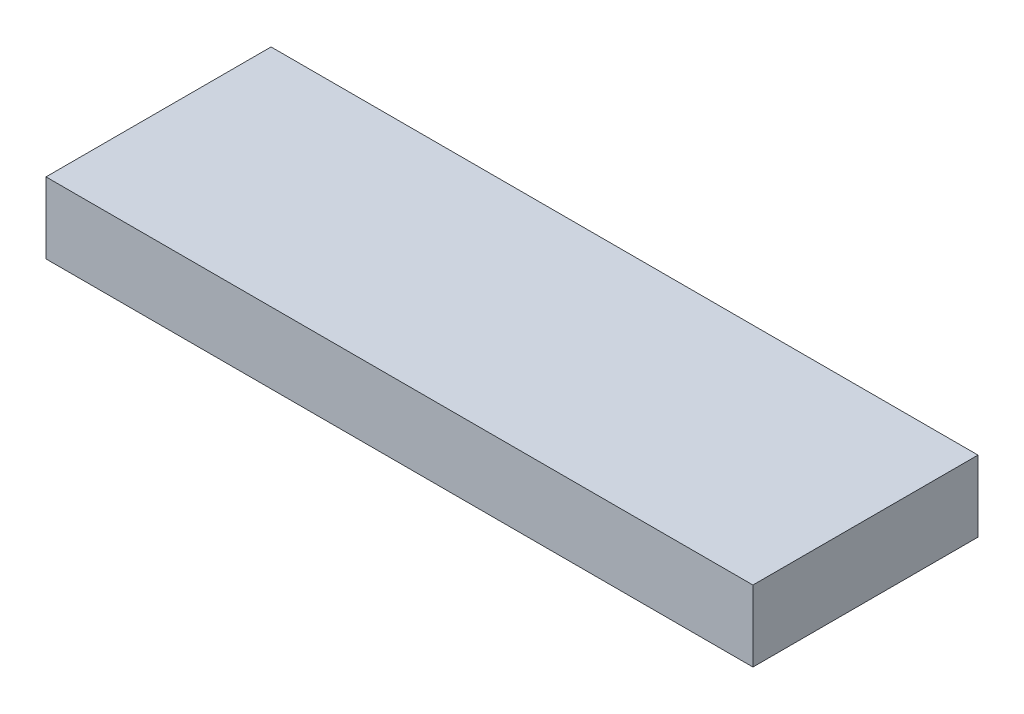
ISO-10303-21;
HEADER;
FILE_DESCRIPTION(('STEP AP214'),'2;1');
FILE_NAME('part.step','',(''),(''),'','','');
FILE_SCHEMA(('AUTOMOTIVE_DESIGN { 1 0 10303 214 1 1 1 1 }'));
ENDSEC;
DATA;
#1=APPLICATION_CONTEXT('core data for automotive mechanical design processes');
#2=APPLICATION_PROTOCOL_DEFINITION('international standard','automotive_design',2000,#1);
#3=PRODUCT_CONTEXT('',#1,'mechanical');
#4=PRODUCT('Part','Part','',(#3));
#5=PRODUCT_RELATED_PRODUCT_CATEGORY('part','',(#4));
#6=PRODUCT_DEFINITION_FORMATION('','',#4);
#7=PRODUCT_DEFINITION_CONTEXT('part definition',#1,'design');
#8=PRODUCT_DEFINITION('design','',#6,#7);
#9=PRODUCT_DEFINITION_SHAPE('','',#8);
#10=(LENGTH_UNIT() NAMED_UNIT(*) SI_UNIT(.MILLI.,.METRE.));
#11=(NAMED_UNIT(*) PLANE_ANGLE_UNIT() SI_UNIT($,.RADIAN.));
#12=(NAMED_UNIT(*) SI_UNIT($,.STERADIAN.) SOLID_ANGLE_UNIT());
#13=UNCERTAINTY_MEASURE_WITH_UNIT(LENGTH_MEASURE(1.E-05),#10,'distance_accuracy_value','');
#14=(GEOMETRIC_REPRESENTATION_CONTEXT(3) GLOBAL_UNCERTAINTY_ASSIGNED_CONTEXT((#13)) GLOBAL_UNIT_ASSIGNED_CONTEXT((#10,
#11,#12)) REPRESENTATION_CONTEXT('',''));
#15=CARTESIAN_POINT('',(0.,0.,0.));
#16=DIRECTION('',(0.,0.,1.));
#17=DIRECTION('',(1.,0.,0.));
#18=AXIS2_PLACEMENT_3D('',#15,#16,#17);
#19=CARTESIAN_POINT('',(0.,0.,0.));
#20=DIRECTION('',(0.,0.,-1.));
#21=DIRECTION('',(-1.,0.,0.));
#22=AXIS2_PLACEMENT_3D('',#19,#20,#21);
#23=PLANE('',#22);
#24=CARTESIAN_POINT('',(-75.688766336441,-273.05,0.));
#25=DIRECTION('',(0.,0.,-1.));
#26=DIRECTION('',(-1.,0.,0.));
#27=AXIS2_PLACEMENT_3D('',#24,#25,#26);
#28=CIRCLE('',#27,1.58750000000001);
#29=CARTESIAN_POINT('',(-77.276266336441,-273.05,0.));
#30=VERTEX_POINT('',#29);
#31=EDGE_CURVE('E39',#30,#30,#28,.T.);
#32=ORIENTED_EDGE('',*,*,#31,.F.);
#33=EDGE_LOOP('',(#32));
#34=FACE_BOUND('',#33,.T.);
#35=CARTESIAN_POINT('',(0.,-273.05,0.));
#36=DIRECTION('',(0.,0.,-1.));
#37=DIRECTION('',(-1.,0.,0.));
#38=AXIS2_PLACEMENT_3D('',#35,#36,#37);
#39=CIRCLE('',#38,1.5875);
#40=CARTESIAN_POINT('',(-1.5875,-273.05,0.));
#41=VERTEX_POINT('',#40);
#42=EDGE_CURVE('E98',#41,#41,#39,.T.);
#43=ORIENTED_EDGE('',*,*,#42,.F.);
#44=EDGE_LOOP('',(#43));
#45=FACE_BOUND('',#44,.T.);
#46=CARTESIAN_POINT('',(75.688766336441,-273.05,0.));
#47=DIRECTION('',(0.,0.,-1.));
#48=DIRECTION('',(-1.,0.,0.));
#49=AXIS2_PLACEMENT_3D('',#46,#47,#48);
#50=CIRCLE('',#49,1.58750000000001);
#51=CARTESIAN_POINT('',(74.101266336441,-273.05,0.));
#52=VERTEX_POINT('',#51);
#53=EDGE_CURVE('E102',#52,#52,#50,.T.);
#54=ORIENTED_EDGE('',*,*,#53,.F.);
#55=EDGE_LOOP('',(#54));
#56=FACE_BOUND('',#55,.T.);
#57=DIRECTION('',(0.,-1.,0.));
#58=VECTOR('',#57,1.);
#59=CARTESIAN_POINT('',(-94.738766336441,-282.575,0.));
#60=LINE('',#59,#58);
#61=CARTESIAN_POINT('',(-94.738766336441,-263.525,0.));
#62=VERTEX_POINT('',#61);
#63=CARTESIAN_POINT('',(-94.738766336441,-282.575,0.));
#64=VERTEX_POINT('',#63);
#65=EDGE_CURVE('E107',#62,#64,#60,.T.);
#66=ORIENTED_EDGE('',*,*,#65,.F.);
#67=DIRECTION('',(-1.,0.,0.));
#68=VECTOR('',#67,1.);
#69=CARTESIAN_POINT('',(-94.738766336441,-263.525,0.));
#70=LINE('',#69,#68);
#71=CARTESIAN_POINT('',(94.738766336441,-263.525,0.));
#72=VERTEX_POINT('',#71);
#73=EDGE_CURVE('E116',#72,#62,#70,.T.);
#74=ORIENTED_EDGE('',*,*,#73,.F.);
#75=DIRECTION('',(0.,1.,0.));
#76=VECTOR('',#75,1.);
#77=CARTESIAN_POINT('',(94.738766336441,-282.575,0.));
#78=LINE('',#77,#76);
#79=CARTESIAN_POINT('',(94.738766336441,-282.575,0.));
#80=VERTEX_POINT('',#79);
#81=EDGE_CURVE('E113',#80,#72,#78,.T.);
#82=ORIENTED_EDGE('',*,*,#81,.F.);
#83=DIRECTION('',(1.,0.,0.));
#84=VECTOR('',#83,1.);
#85=CARTESIAN_POINT('',(-94.738766336441,-282.575,0.));
#86=LINE('',#85,#84);
#87=EDGE_CURVE('E110',#64,#80,#86,.T.);
#88=ORIENTED_EDGE('',*,*,#87,.F.);
#89=EDGE_LOOP('',(#66,#74,#82,#88));
#90=FACE_BOUND('',#89,.T.);
#91=ADVANCED_FACE('F35',(#34,#45,#56,#90),#23,.T.);
#92=CARTESIAN_POINT('',(-94.738766336441,-263.525,250.757764743368));
#93=DIRECTION('',(0.,-1.,0.));
#94=DIRECTION('',(0.,0.,-1.));
#95=AXIS2_PLACEMENT_3D('',#92,#93,#94);
#96=PLANE('',#95);
#97=DIRECTION('',(0.,0.,-1.));
#98=VECTOR('',#97,1.);
#99=CARTESIAN_POINT('',(-94.738766336441,-263.525,250.757764743368));
#100=LINE('',#99,#98);
#101=CARTESIAN_POINT('',(-94.738766336441,-263.525,60.325));
#102=VERTEX_POINT('',#101);
#103=EDGE_CURVE('E119',#102,#62,#100,.T.);
#104=ORIENTED_EDGE('',*,*,#103,.F.);
#105=DIRECTION('',(1.,0.,0.));
#106=VECTOR('',#105,1.);
#107=CARTESIAN_POINT('',(-94.738766336441,-263.525,60.325));
#108=LINE('',#107,#106);
#109=CARTESIAN_POINT('',(94.738766336441,-263.525,60.325));
#110=VERTEX_POINT('',#109);
#111=EDGE_CURVE('E56',#102,#110,#108,.T.);
#112=ORIENTED_EDGE('',*,*,#111,.T.);
#113=DIRECTION('',(0.,0.,-1.));
#114=VECTOR('',#113,1.);
#115=CARTESIAN_POINT('',(94.738766336441,-263.525,250.757764743368));
#116=LINE('',#115,#114);
#117=EDGE_CURVE('E121',#110,#72,#116,.T.);
#118=ORIENTED_EDGE('',*,*,#117,.T.);
#119=ORIENTED_EDGE('',*,*,#73,.T.);
#120=EDGE_LOOP('',(#104,#112,#118,#119));
#121=FACE_BOUND('',#120,.T.);
#122=ADVANCED_FACE('F136',(#121),#96,.F.);
#123=CARTESIAN_POINT('',(94.738766336441,-282.575,250.757764743368));
#124=DIRECTION('',(-1.,0.,0.));
#125=DIRECTION('',(0.,0.,1.));
#126=AXIS2_PLACEMENT_3D('',#123,#124,#125);
#127=PLANE('',#126);
#128=ORIENTED_EDGE('',*,*,#117,.F.);
#129=DIRECTION('',(0.,-1.,0.));
#130=VECTOR('',#129,1.);
#131=CARTESIAN_POINT('',(94.738766336441,-282.575,60.325));
#132=LINE('',#131,#130);
#133=CARTESIAN_POINT('',(94.738766336441,-282.575,60.325));
#134=VERTEX_POINT('',#133);
#135=EDGE_CURVE('E103',#110,#134,#132,.T.);
#136=ORIENTED_EDGE('',*,*,#135,.T.);
#137=DIRECTION('',(0.,0.,-1.));
#138=VECTOR('',#137,1.);
#139=CARTESIAN_POINT('',(94.738766336441,-282.575,250.757764743368));
#140=LINE('',#139,#138);
#141=EDGE_CURVE('E123',#134,#80,#140,.T.);
#142=ORIENTED_EDGE('',*,*,#141,.T.);
#143=ORIENTED_EDGE('',*,*,#81,.T.);
#144=EDGE_LOOP('',(#128,#136,#142,#143));
#145=FACE_BOUND('',#144,.T.);
#146=ADVANCED_FACE('F151',(#145),#127,.F.);
#147=CARTESIAN_POINT('',(-94.738766336441,-282.575,250.757764743368));
#148=DIRECTION('',(0.,1.,0.));
#149=DIRECTION('',(0.,0.,1.));
#150=AXIS2_PLACEMENT_3D('',#147,#148,#149);
#151=PLANE('',#150);
#152=ORIENTED_EDGE('',*,*,#141,.F.);
#153=DIRECTION('',(-1.,0.,0.));
#154=VECTOR('',#153,1.);
#155=CARTESIAN_POINT('',(-94.738766336441,-282.575,60.325));
#156=LINE('',#155,#154);
#157=CARTESIAN_POINT('',(-94.738766336441,-282.575,60.325));
#158=VERTEX_POINT('',#157);
#159=EDGE_CURVE('E44',#134,#158,#156,.T.);
#160=ORIENTED_EDGE('',*,*,#159,.T.);
#161=DIRECTION('',(0.,0.,-1.));
#162=VECTOR('',#161,1.);
#163=CARTESIAN_POINT('',(-94.738766336441,-282.575,250.757764743368));
#164=LINE('',#163,#162);
#165=EDGE_CURVE('E125',#158,#64,#164,.T.);
#166=ORIENTED_EDGE('',*,*,#165,.T.);
#167=ORIENTED_EDGE('',*,*,#87,.T.);
#168=EDGE_LOOP('',(#152,#160,#166,#167));
#169=FACE_BOUND('',#168,.T.);
#170=ADVANCED_FACE('F153',(#169),#151,.F.);
#171=CARTESIAN_POINT('',(-94.738766336441,-282.575,250.757764743368));
#172=DIRECTION('',(1.,0.,0.));
#173=DIRECTION('',(0.,0.,-1.));
#174=AXIS2_PLACEMENT_3D('',#171,#172,#173);
#175=PLANE('',#174);
#176=ORIENTED_EDGE('',*,*,#165,.F.);
#177=DIRECTION('',(0.,1.,0.));
#178=VECTOR('',#177,1.);
#179=CARTESIAN_POINT('',(-94.738766336441,-282.575,60.325));
#180=LINE('',#179,#178);
#181=EDGE_CURVE('E11',#158,#102,#180,.T.);
#182=ORIENTED_EDGE('',*,*,#181,.T.);
#183=ORIENTED_EDGE('',*,*,#103,.T.);
#184=ORIENTED_EDGE('',*,*,#65,.T.);
#185=EDGE_LOOP('',(#176,#182,#183,#184));
#186=FACE_BOUND('',#185,.T.);
#187=ADVANCED_FACE('F37',(#186),#175,.F.);
#188=CARTESIAN_POINT('',(-94.738766336441,-19.0499999999982,60.325));
#189=DIRECTION('',(0.,0.,-1.));
#190=DIRECTION('',(-1.,0.,0.));
#191=AXIS2_PLACEMENT_3D('',#188,#189,#190);
#192=PLANE('',#191);
#193=ORIENTED_EDGE('',*,*,#159,.F.);
#194=ORIENTED_EDGE('',*,*,#135,.F.);
#195=ORIENTED_EDGE('',*,*,#111,.F.);
#196=ORIENTED_EDGE('',*,*,#181,.F.);
#197=EDGE_LOOP('',(#193,#194,#195,#196));
#198=FACE_BOUND('',#197,.T.);
#199=ADVANCED_FACE('F159',(#198),#192,.F.);
#200=CARTESIAN_POINT('',(75.688766336441,-273.05,12.6999999999991));
#201=DIRECTION('',(0.,0.,-1.));
#202=DIRECTION('',(-1.,0.,0.));
#203=AXIS2_PLACEMENT_3D('',#200,#201,#202);
#204=CONICAL_SURFACE('',#203,1.58750000000001,1.02974425867666);
#205=CARTESIAN_POINT('',(75.688766336441,-273.05,13.6538662327054));
#206=VERTEX_POINT('',#205);
#207=VERTEX_LOOP('',#206);
#208=FACE_BOUND('',#207,.T.);
#209=CARTESIAN_POINT('',(75.688766336441,-273.05,12.6999999999991));
#210=DIRECTION('',(0.,0.,-1.));
#211=DIRECTION('',(-1.,0.,0.));
#212=AXIS2_PLACEMENT_3D('',#209,#210,#211);
#213=CIRCLE('',#212,1.58750000000001);
#214=CARTESIAN_POINT('',(74.101266336441,-273.05,12.6999999999991));
#215=VERTEX_POINT('',#214);
#216=EDGE_CURVE('E99',#215,#215,#213,.T.);
#217=ORIENTED_EDGE('',*,*,#216,.T.);
#218=EDGE_LOOP('',(#217));
#219=FACE_BOUND('',#218,.T.);
#220=ADVANCED_FACE('F166',(#208,#219),#204,.F.);
#221=CARTESIAN_POINT('',(75.688766336441,-273.05,-25.4000000000009));
#222=DIRECTION('',(0.,0.,-1.));
#223=DIRECTION('',(-1.,0.,0.));
#224=AXIS2_PLACEMENT_3D('',#221,#222,#223);
#225=CYLINDRICAL_SURFACE('',#224,1.58750000000001);
#226=ORIENTED_EDGE('',*,*,#53,.T.);
#227=EDGE_LOOP('',(#226));
#228=FACE_BOUND('',#227,.T.);
#229=ORIENTED_EDGE('',*,*,#216,.F.);
#230=EDGE_LOOP('',(#229));
#231=FACE_BOUND('',#230,.T.);
#232=ADVANCED_FACE('F169',(#228,#231),#225,.F.);
#233=CARTESIAN_POINT('',(0.,-273.05,12.6999999999991));
#234=DIRECTION('',(0.,0.,-1.));
#235=DIRECTION('',(-1.,0.,0.));
#236=AXIS2_PLACEMENT_3D('',#233,#234,#235);
#237=CONICAL_SURFACE('',#236,1.5875,1.02974425867666);
#238=CARTESIAN_POINT('',(0.,-273.05,13.6538662327054));
#239=VERTEX_POINT('',#238);
#240=VERTEX_LOOP('',#239);
#241=FACE_BOUND('',#240,.T.);
#242=CARTESIAN_POINT('',(0.,-273.05,12.6999999999991));
#243=DIRECTION('',(0.,0.,-1.));
#244=DIRECTION('',(-1.,0.,0.));
#245=AXIS2_PLACEMENT_3D('',#242,#243,#244);
#246=CIRCLE('',#245,1.5875);
#247=CARTESIAN_POINT('',(-1.58749999999999,-273.05,12.6999999999991));
#248=VERTEX_POINT('',#247);
#249=EDGE_CURVE('E94',#248,#248,#246,.T.);
#250=ORIENTED_EDGE('',*,*,#249,.T.);
#251=EDGE_LOOP('',(#250));
#252=FACE_BOUND('',#251,.T.);
#253=ADVANCED_FACE('F173',(#241,#252),#237,.F.);
#254=CARTESIAN_POINT('',(0.,-273.05,-25.4000000000009));
#255=DIRECTION('',(0.,0.,-1.));
#256=DIRECTION('',(-1.,0.,0.));
#257=AXIS2_PLACEMENT_3D('',#254,#255,#256);
#258=CYLINDRICAL_SURFACE('',#257,1.5875);
#259=ORIENTED_EDGE('',*,*,#42,.T.);
#260=EDGE_LOOP('',(#259));
#261=FACE_BOUND('',#260,.T.);
#262=ORIENTED_EDGE('',*,*,#249,.F.);
#263=EDGE_LOOP('',(#262));
#264=FACE_BOUND('',#263,.T.);
#265=ADVANCED_FACE('F86',(#261,#264),#258,.F.);
#266=CARTESIAN_POINT('',(-75.688766336441,-273.05,12.6999999999991));
#267=DIRECTION('',(0.,0.,-1.));
#268=DIRECTION('',(-1.,0.,0.));
#269=AXIS2_PLACEMENT_3D('',#266,#267,#268);
#270=CONICAL_SURFACE('',#269,1.58750000000001,1.02974425867666);
#271=CARTESIAN_POINT('',(-75.688766336441,-273.05,13.6538662327054));
#272=VERTEX_POINT('',#271);
#273=VERTEX_LOOP('',#272);
#274=FACE_BOUND('',#273,.T.);
#275=CARTESIAN_POINT('',(-75.688766336441,-273.05,12.6999999999991));
#276=DIRECTION('',(0.,0.,-1.));
#277=DIRECTION('',(-1.,0.,0.));
#278=AXIS2_PLACEMENT_3D('',#275,#276,#277);
#279=CIRCLE('',#278,1.58750000000001);
#280=CARTESIAN_POINT('',(-77.276266336441,-273.05,12.6999999999991));
#281=VERTEX_POINT('',#280);
#282=EDGE_CURVE('E90',#281,#281,#279,.T.);
#283=ORIENTED_EDGE('',*,*,#282,.T.);
#284=EDGE_LOOP('',(#283));
#285=FACE_BOUND('',#284,.T.);
#286=ADVANCED_FACE('F82',(#274,#285),#270,.F.);
#287=CARTESIAN_POINT('',(-75.688766336441,-273.05,-25.4000000000009));
#288=DIRECTION('',(0.,0.,-1.));
#289=DIRECTION('',(-1.,0.,0.));
#290=AXIS2_PLACEMENT_3D('',#287,#288,#289);
#291=CYLINDRICAL_SURFACE('',#290,1.58750000000001);
#292=ORIENTED_EDGE('',*,*,#31,.T.);
#293=EDGE_LOOP('',(#292));
#294=FACE_BOUND('',#293,.T.);
#295=ORIENTED_EDGE('',*,*,#282,.F.);
#296=EDGE_LOOP('',(#295));
#297=FACE_BOUND('',#296,.T.);
#298=ADVANCED_FACE('F85',(#294,#297),#291,.F.);
#299=CLOSED_SHELL('',(#91,#122,#146,#170,#187,#199,#220,#232,#253,#265,#286,#298));
#300=MANIFOLD_SOLID_BREP('B2',#299);
#301=ADVANCED_BREP_SHAPE_REPRESENTATION('',(#18,#300),#14);
#302=SHAPE_DEFINITION_REPRESENTATION(#9,#301);
ENDSEC;
END-ISO-10303-21;
